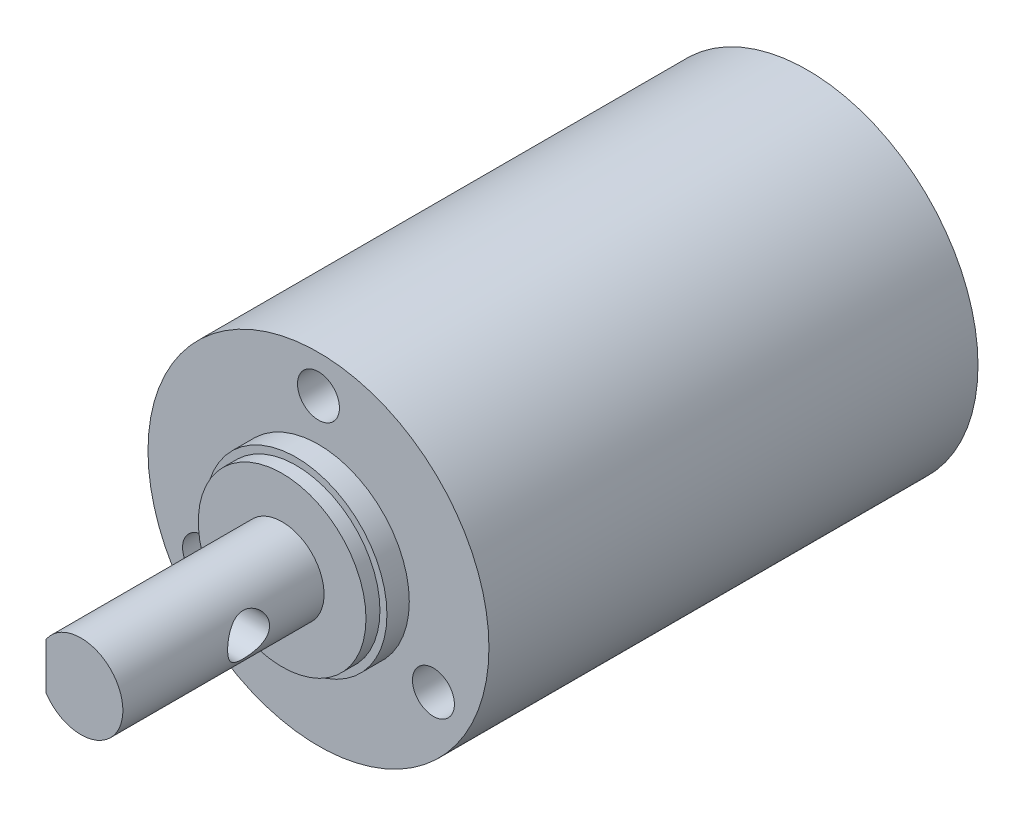
ISO-10303-21;
HEADER;
FILE_DESCRIPTION(('STEP AP214'),'2;1');
FILE_NAME('part.step','',(''),(''),'','','');
FILE_SCHEMA(('AUTOMOTIVE_DESIGN { 1 0 10303 214 1 1 1 1 }'));
ENDSEC;
DATA;
#1=APPLICATION_CONTEXT('core data for automotive mechanical design processes');
#2=APPLICATION_PROTOCOL_DEFINITION('international standard','automotive_design',2000,#1);
#3=PRODUCT_CONTEXT('',#1,'mechanical');
#4=PRODUCT('Part','Part','',(#3));
#5=PRODUCT_RELATED_PRODUCT_CATEGORY('part','',(#4));
#6=PRODUCT_DEFINITION_FORMATION('','',#4);
#7=PRODUCT_DEFINITION_CONTEXT('part definition',#1,'design');
#8=PRODUCT_DEFINITION('design','',#6,#7);
#9=PRODUCT_DEFINITION_SHAPE('','',#8);
#10=(LENGTH_UNIT() NAMED_UNIT(*) SI_UNIT(.MILLI.,.METRE.));
#11=(NAMED_UNIT(*) PLANE_ANGLE_UNIT() SI_UNIT($,.RADIAN.));
#12=(NAMED_UNIT(*) SI_UNIT($,.STERADIAN.) SOLID_ANGLE_UNIT());
#13=UNCERTAINTY_MEASURE_WITH_UNIT(LENGTH_MEASURE(1.E-05),#10,'distance_accuracy_value','');
#14=(GEOMETRIC_REPRESENTATION_CONTEXT(3) GLOBAL_UNCERTAINTY_ASSIGNED_CONTEXT((#13)) GLOBAL_UNIT_ASSIGNED_CONTEXT((#10,
#11,#12)) REPRESENTATION_CONTEXT('',''));
#15=CARTESIAN_POINT('',(0.,0.,0.));
#16=DIRECTION('',(0.,0.,1.));
#17=DIRECTION('',(1.,0.,0.));
#18=AXIS2_PLACEMENT_3D('',#15,#16,#17);
#19=CARTESIAN_POINT('',(0.,0.,37.6));
#20=DIRECTION('',(0.,0.,-1.));
#21=DIRECTION('',(-1.,0.,0.));
#22=AXIS2_PLACEMENT_3D('',#19,#20,#21);
#23=CYLINDRICAL_SURFACE('',#22,6.5);
#24=CARTESIAN_POINT('',(0.,0.,35.));
#25=DIRECTION('',(0.,0.,1.));
#26=DIRECTION('',(1.,0.,0.));
#27=AXIS2_PLACEMENT_3D('',#24,#25,#26);
#28=CIRCLE('',#27,6.5);
#29=CARTESIAN_POINT('',(6.5,0.,35.));
#30=VERTEX_POINT('',#29);
#31=EDGE_CURVE('E86',#30,#30,#28,.T.);
#32=ORIENTED_EDGE('',*,*,#31,.T.);
#33=EDGE_LOOP('',(#32));
#34=FACE_BOUND('',#33,.T.);
#35=CARTESIAN_POINT('',(0.,0.,36.6));
#36=DIRECTION('',(0.,0.,1.));
#37=DIRECTION('',(1.,0.,0.));
#38=AXIS2_PLACEMENT_3D('',#35,#36,#37);
#39=CIRCLE('',#38,6.5);
#40=CARTESIAN_POINT('',(6.5,0.,36.6));
#41=VERTEX_POINT('',#40);
#42=EDGE_CURVE('E77',#41,#41,#39,.T.);
#43=ORIENTED_EDGE('',*,*,#42,.F.);
#44=EDGE_LOOP('',(#43));
#45=FACE_BOUND('',#44,.T.);
#46=ADVANCED_FACE('F35',(#34,#45),#23,.T.);
#47=CARTESIAN_POINT('',(0.,0.,35.));
#48=DIRECTION('',(0.,0.,1.));
#49=DIRECTION('',(1.,0.,0.));
#50=AXIS2_PLACEMENT_3D('',#47,#48,#49);
#51=PLANE('',#50);
#52=CARTESIAN_POINT('',(-8.22724133595156,-4.75000000000035,35.));
#53=DIRECTION('',(0.,0.,1.));
#54=DIRECTION('',(1.,0.,0.));
#55=AXIS2_PLACEMENT_3D('',#52,#53,#54);
#56=CIRCLE('',#55,1.50000000000077);
#57=CARTESIAN_POINT('',(-6.72724133595079,-4.75000000000035,35.));
#58=VERTEX_POINT('',#57);
#59=EDGE_CURVE('E278',#58,#58,#56,.T.);
#60=ORIENTED_EDGE('',*,*,#59,.F.);
#61=EDGE_LOOP('',(#60));
#62=FACE_BOUND('',#61,.T.);
#63=CARTESIAN_POINT('',(8.22724133595277,-4.74999999999965,35.));
#64=DIRECTION('',(0.,0.,1.));
#65=DIRECTION('',(1.,0.,0.));
#66=AXIS2_PLACEMENT_3D('',#63,#64,#65);
#67=CIRCLE('',#66,1.50000000000052);
#68=CARTESIAN_POINT('',(9.7272413359533,-4.74999999999965,35.));
#69=VERTEX_POINT('',#68);
#70=EDGE_CURVE('E277',#69,#69,#67,.T.);
#71=ORIENTED_EDGE('',*,*,#70,.F.);
#72=EDGE_LOOP('',(#71));
#73=FACE_BOUND('',#72,.T.);
#74=CARTESIAN_POINT('',(0.,9.5,35.));
#75=DIRECTION('',(0.,0.,1.));
#76=DIRECTION('',(1.,0.,0.));
#77=AXIS2_PLACEMENT_3D('',#74,#75,#76);
#78=CIRCLE('',#77,1.5);
#79=CARTESIAN_POINT('',(1.5,9.5,35.));
#80=VERTEX_POINT('',#79);
#81=EDGE_CURVE('E287',#80,#80,#78,.T.);
#82=ORIENTED_EDGE('',*,*,#81,.F.);
#83=EDGE_LOOP('',(#82));
#84=FACE_BOUND('',#83,.T.);
#85=CARTESIAN_POINT('',(0.,0.,35.));
#86=DIRECTION('',(0.,0.,1.));
#87=DIRECTION('',(1.,0.,0.));
#88=AXIS2_PLACEMENT_3D('',#85,#86,#87);
#89=CIRCLE('',#88,12.2);
#90=CARTESIAN_POINT('',(12.2,0.,35.));
#91=VERTEX_POINT('',#90);
#92=EDGE_CURVE('E11',#91,#91,#89,.T.);
#93=ORIENTED_EDGE('',*,*,#92,.T.);
#94=EDGE_LOOP('',(#93));
#95=FACE_BOUND('',#94,.T.);
#96=ORIENTED_EDGE('',*,*,#31,.F.);
#97=EDGE_LOOP('',(#96));
#98=FACE_BOUND('',#97,.T.);
#99=ADVANCED_FACE('F104',(#62,#73,#84,#95,#98),#51,.T.);
#100=CARTESIAN_POINT('',(0.,0.,35.));
#101=DIRECTION('',(0.,0.,-1.));
#102=DIRECTION('',(-1.,0.,0.));
#103=AXIS2_PLACEMENT_3D('',#100,#101,#102);
#104=CYLINDRICAL_SURFACE('',#103,12.2);
#105=ORIENTED_EDGE('',*,*,#92,.F.);
#106=EDGE_LOOP('',(#105));
#107=FACE_BOUND('',#106,.T.);
#108=CARTESIAN_POINT('',(0.,0.,0.));
#109=DIRECTION('',(0.,0.,1.));
#110=DIRECTION('',(1.,0.,0.));
#111=AXIS2_PLACEMENT_3D('',#108,#109,#110);
#112=CIRCLE('',#111,12.2);
#113=CARTESIAN_POINT('',(12.2,0.,0.));
#114=VERTEX_POINT('',#113);
#115=EDGE_CURVE('E39',#114,#114,#112,.T.);
#116=ORIENTED_EDGE('',*,*,#115,.T.);
#117=EDGE_LOOP('',(#116));
#118=FACE_BOUND('',#117,.T.);
#119=ADVANCED_FACE('F37',(#107,#118),#104,.T.);
#120=CARTESIAN_POINT('',(0.,0.,0.));
#121=DIRECTION('',(0.,0.,1.));
#122=DIRECTION('',(1.,0.,0.));
#123=AXIS2_PLACEMENT_3D('',#120,#121,#122);
#124=PLANE('',#123);
#125=ORIENTED_EDGE('',*,*,#115,.F.);
#126=EDGE_LOOP('',(#125));
#127=FACE_BOUND('',#126,.T.);
#128=ADVANCED_FACE('F94',(#127),#124,.F.);
#129=CARTESIAN_POINT('',(0.,0.,36.6));
#130=DIRECTION('',(0.,0.,1.));
#131=DIRECTION('',(1.,0.,0.));
#132=AXIS2_PLACEMENT_3D('',#129,#130,#131);
#133=PLANE('',#132);
#134=CARTESIAN_POINT('',(0.,0.,36.6));
#135=DIRECTION('',(0.,0.,1.));
#136=DIRECTION('',(1.,0.,0.));
#137=AXIS2_PLACEMENT_3D('',#134,#135,#136);
#138=CIRCLE('',#137,6.);
#139=CARTESIAN_POINT('',(6.,0.,36.6));
#140=VERTEX_POINT('',#139);
#141=EDGE_CURVE('E80',#140,#140,#138,.T.);
#142=ORIENTED_EDGE('',*,*,#141,.F.);
#143=EDGE_LOOP('',(#142));
#144=FACE_BOUND('',#143,.T.);
#145=ORIENTED_EDGE('',*,*,#42,.T.);
#146=EDGE_LOOP('',(#145));
#147=FACE_BOUND('',#146,.T.);
#148=ADVANCED_FACE('F96',(#144,#147),#133,.T.);
#149=CARTESIAN_POINT('',(0.,0.,36.6));
#150=DIRECTION('',(0.,0.,1.));
#151=DIRECTION('',(1.,0.,0.));
#152=AXIS2_PLACEMENT_3D('',#149,#150,#151);
#153=CYLINDRICAL_SURFACE('',#152,6.);
#154=ORIENTED_EDGE('',*,*,#141,.T.);
#155=EDGE_LOOP('',(#154));
#156=FACE_BOUND('',#155,.T.);
#157=CARTESIAN_POINT('',(0.,0.,37.6));
#158=DIRECTION('',(0.,0.,1.));
#159=DIRECTION('',(1.,0.,0.));
#160=AXIS2_PLACEMENT_3D('',#157,#158,#159);
#161=CIRCLE('',#160,6.);
#162=CARTESIAN_POINT('',(6.,0.,37.6));
#163=VERTEX_POINT('',#162);
#164=EDGE_CURVE('E132',#163,#163,#161,.T.);
#165=ORIENTED_EDGE('',*,*,#164,.F.);
#166=EDGE_LOOP('',(#165));
#167=FACE_BOUND('',#166,.T.);
#168=ADVANCED_FACE('F101',(#156,#167),#153,.T.);
#169=CARTESIAN_POINT('',(0.,0.,52.));
#170=DIRECTION('',(0.,0.,1.));
#171=DIRECTION('',(1.,0.,0.));
#172=AXIS2_PLACEMENT_3D('',#169,#170,#171);
#173=PLANE('',#172);
#174=CARTESIAN_POINT('',(0.,0.,52.));
#175=DIRECTION('',(0.,0.,1.));
#176=DIRECTION('',(1.,0.,0.));
#177=AXIS2_PLACEMENT_3D('',#174,#175,#176);
#178=CIRCLE('',#177,3.);
#179=CARTESIAN_POINT('',(-2.5,-1.6583123951777,52.));
#180=VERTEX_POINT('',#179);
#181=CARTESIAN_POINT('',(-2.5,1.6583123951777,52.));
#182=VERTEX_POINT('',#181);
#183=EDGE_CURVE('E71',#180,#182,#178,.T.);
#184=ORIENTED_EDGE('',*,*,#183,.T.);
#185=DIRECTION('',(0.,-1.,0.));
#186=VECTOR('',#185,1.);
#187=CARTESIAN_POINT('',(-2.5,1.6583123951777,52.));
#188=LINE('',#187,#186);
#189=EDGE_CURVE('E58',#182,#180,#188,.T.);
#190=ORIENTED_EDGE('',*,*,#189,.T.);
#191=EDGE_LOOP('',(#184,#190));
#192=FACE_BOUND('',#191,.T.);
#193=ADVANCED_FACE('F121',(#192),#173,.T.);
#194=CARTESIAN_POINT('',(0.,0.,52.));
#195=DIRECTION('',(0.,0.,-1.));
#196=DIRECTION('',(-1.,0.,0.));
#197=AXIS2_PLACEMENT_3D('',#194,#195,#196);
#198=CYLINDRICAL_SURFACE('',#197,3.);
#199=CARTESIAN_POINT('',(3.,0.,44.5));
#200=CARTESIAN_POINT('',(2.99999570107562,0.0788579444268501,44.4999950465242));
#201=CARTESIAN_POINT('',(2.99685736529635,0.157809899546343,44.4937448903184));
#202=CARTESIAN_POINT('',(2.98461234055736,0.313380352903344,44.4690206794877));
#203=CARTESIAN_POINT('',(2.97549431743379,0.389994130070445,44.4505234105033));
#204=CARTESIAN_POINT('',(2.95224419105063,0.538400317320674,44.4022092870751));
#205=CARTESIAN_POINT('',(2.93813158766306,0.610210204408719,44.3724364236281));
#206=CARTESIAN_POINT('',(2.90618664773642,0.747708925209898,44.3026440679525));
#207=CARTESIAN_POINT('',(2.88835460450288,0.81339824098509,44.2626253836267));
#208=CARTESIAN_POINT('',(2.84934387387093,0.941261726642865,44.1707241257721));
#209=CARTESIAN_POINT('',(2.82802798691306,1.00298281668316,44.1182702811405));
#210=CARTESIAN_POINT('',(2.78489955370115,1.11716916730047,44.0042177811295));
#211=CARTESIAN_POINT('',(2.76308664313552,1.16962737466015,43.9426122223413));
#212=CARTESIAN_POINT('',(2.71948426796021,1.26787800067542,43.8062749757149));
#213=CARTESIAN_POINT('',(2.69782780455198,1.31283800332746,43.7308958524811));
#214=CARTESIAN_POINT('',(2.65928968158481,1.38925234033605,43.5724489960207));
#215=CARTESIAN_POINT('',(2.64240461410484,1.4207163224495,43.4893868069159));
#216=CARTESIAN_POINT('',(2.61686800556713,1.46719866328289,43.3230023418671));
#217=CARTESIAN_POINT('',(2.6077840737557,1.48308878562067,43.2399933218989));
#218=CARTESIAN_POINT('',(2.59772834922791,1.50064048996327,43.0720317433308));
#219=CARTESIAN_POINT('',(2.59674854014932,1.50231613255961,42.9870811886933));
#220=CARTESIAN_POINT('',(2.60266395385873,1.49203093075845,42.828570963527));
#221=CARTESIAN_POINT('',(2.6086314549302,1.48167683930524,42.7548639531654));
#222=CARTESIAN_POINT('',(2.62614343100775,1.4504097735854,42.6104171359404));
#223=CARTESIAN_POINT('',(2.63768968247664,1.42949343584648,42.539678282042));
#224=CARTESIAN_POINT('',(2.66531214619111,1.37731467057901,42.4011563011515));
#225=CARTESIAN_POINT('',(2.68148760995998,1.34582260067399,42.3334804018213));
#226=CARTESIAN_POINT('',(2.71655106422105,1.273562531502,42.204048561115));
#227=CARTESIAN_POINT('',(2.73544027170286,1.2327903657187,42.1422952965999));
#228=CARTESIAN_POINT('',(2.77669736854929,1.13709908236919,42.0182181208852));
#229=CARTESIAN_POINT('',(2.79920265355119,1.08104168755392,41.9568146896358));
#230=CARTESIAN_POINT('',(2.84321434950611,0.959333368112058,41.8438968721137));
#231=CARTESIAN_POINT('',(2.86472027938201,0.893677884861427,41.7923872119492));
#232=CARTESIAN_POINT('',(2.90552980924446,0.750774758747772,41.6984715084554));
#233=CARTESIAN_POINT('',(2.92468476243011,0.673130387399112,41.6565992913314));
#234=CARTESIAN_POINT('',(2.95736821681863,0.510699323233194,41.5868544564355));
#235=CARTESIAN_POINT('',(2.9709011841533,0.425918364397914,41.5589707224773));
#236=CARTESIAN_POINT('',(2.98986500612153,0.259149737491055,41.520286894425));
#237=CARTESIAN_POINT('',(2.99587407451965,0.177512295822491,41.5082631463798));
#238=CARTESIAN_POINT('',(3.00109520188655,0.0131693999240301,41.4978029032983));
#239=CARTESIAN_POINT('',(3.00031048081978,-0.0695355298048597,41.4993599715408));
#240=CARTESIAN_POINT('',(2.99236788380152,-0.226849457978976,41.5153100326281));
#241=CARTESIAN_POINT('',(2.98570868532253,-0.301589112074892,41.528698799095));
#242=CARTESIAN_POINT('',(2.9673325697226,-0.447610338452909,41.5663571078427));
#243=CARTESIAN_POINT('',(2.95561509501618,-0.518891528536628,41.5906278496802));
#244=CARTESIAN_POINT('',(2.92776377120382,-0.658332912674357,41.6499976996495));
#245=CARTESIAN_POINT('',(2.91151322654446,-0.726345595508701,41.6853865751744));
#246=CARTESIAN_POINT('',(2.87615961476127,-0.855692042548905,41.7656613034698));
#247=CARTESIAN_POINT('',(2.85705533350407,-0.917022944664887,41.8105512018931));
#248=CARTESIAN_POINT('',(2.81562332004297,-1.03765153393382,41.9136406379961));
#249=CARTESIAN_POINT('',(2.79316327265249,-1.09615811672854,41.9727143026677));
#250=CARTESIAN_POINT('',(2.7489358741323,-1.20278448167828,42.0998877269166));
#251=CARTESIAN_POINT('',(2.72716901100071,-1.25089707856781,42.1679936782719));
#252=CARTESIAN_POINT('',(2.68576788309734,-1.33756187171853,42.3154654812595));
#253=CARTESIAN_POINT('',(2.66628794383591,-1.37553824370037,42.3952168991417));
#254=CARTESIAN_POINT('',(2.63361108441202,-1.43712423890206,42.5612651013624));
#255=CARTESIAN_POINT('',(2.62040607332625,-1.46075237380053,42.6475532897003));
#256=CARTESIAN_POINT('',(2.60342251538703,-1.49079253120031,42.8153653343271));
#257=CARTESIAN_POINT('',(2.59886075197597,-1.49863949460818,42.8965513801529));
#258=CARTESIAN_POINT('',(2.59748031962405,-1.50103373156431,43.0591706007468));
#259=CARTESIAN_POINT('',(2.60065829439585,-1.49558676993487,43.1406036531068));
#260=CARTESIAN_POINT('',(2.61356793076615,-1.47288918838997,43.2932252523002));
#261=CARTESIAN_POINT('',(2.62264641723987,-1.45681247151455,43.3646507052171));
#262=CARTESIAN_POINT('',(2.64556524281479,-1.41476303733662,43.5037121791365));
#263=CARTESIAN_POINT('',(2.65940711354502,-1.38878713673989,43.571346973138));
#264=CARTESIAN_POINT('',(2.69142795546803,-1.32572361795085,43.7059372764798));
#265=CARTESIAN_POINT('',(2.70983583593881,-1.28800670672356,43.7725418527435));
#266=CARTESIAN_POINT('',(2.7485299745229,-1.20322645745609,43.8989118042719));
#267=CARTESIAN_POINT('',(2.76881720693416,-1.15615825686235,43.9586735957817));
#268=CARTESIAN_POINT('',(2.81193484737138,-1.04730498999207,44.077212973532));
#269=CARTESIAN_POINT('',(2.83477474959942,-0.984426634495897,44.1349886535254));
#270=CARTESIAN_POINT('',(2.87816628389896,-0.849232209349801,44.2393944751529));
#271=CARTESIAN_POINT('',(2.89871667939292,-0.776911084957803,44.2860186092049));
#272=CARTESIAN_POINT('',(2.93547014349806,-0.623897395174429,44.3668545440681));
#273=CARTESIAN_POINT('',(2.95164144740899,-0.543149255665106,44.4009762538547));
#274=CARTESIAN_POINT('',(2.9775201194848,-0.376113151707139,44.4547122516361));
#275=CARTESIAN_POINT('',(2.98724585044602,-0.289841699383657,44.4743677702086));
#276=CARTESIAN_POINT('',(2.99543192870217,-0.168902919736349,44.4908461166286));
#277=CARTESIAN_POINT('',(2.99714048010376,-0.135242819162353,44.4942739612995));
#278=CARTESIAN_POINT('',(2.99942545465223,-0.0677275977076409,44.4988519982711));
#279=CARTESIAN_POINT('',(3.00000184655071,-0.0338724714699444,44.5000021277053));
#280=CARTESIAN_POINT('',(3.,0.,44.5));
#281=B_SPLINE_CURVE_WITH_KNOTS('',3,(#199,#200,#201,#202,#203,#204,#205,#206,#207,#208,#209,
#210,#211,#212,#213,#214,#215,#216,#217,#218,#219,#220,#221,#222,#223,#224,#225,#226,#227,#228,
#229,#230,#231,#232,#233,#234,#235,#236,#237,#238,#239,#240,#241,#242,#243,#244,#245,#246,#247,
#248,#249,#250,#251,#252,#253,#254,#255,#256,#257,#258,#259,#260,#261,#262,#263,#264,#265,#266,
#267,#268,#269,#270,#271,#272,#273,#274,#275,#276,#277,#278,#279,#280),.UNSPECIFIED.,.T.,.F.,(4,
2,2,2,2,2,2,2,2,2,2,2,2,2,2,2,2,2,2,2,2,2,2,2,2,2,2,2,2,2,2,2,2,2,2,2,2,2,2,2,4),(0.,
0.236436386130438,0.473322224563797,0.709293233238445,0.945245640872351,1.19547263807713,
1.44588935648105,1.71572589646129,1.98536921847422,2.23887018210345,2.49212035993531,
2.71508568613981,2.93812205888519,3.16635360252732,3.39468781890334,3.65197412000819,
3.90938301898031,4.17874533321662,4.44789325368421,4.6947493570702,4.94148846767215,
5.16910359759184,5.39674382446399,5.63089284041849,5.8651417612251,6.12239415966629,
6.3798238292315,6.6497202324259,6.91926767918178,7.16293961254571,7.40650589797019,
7.62686895373285,7.84730293182529,8.08254685170433,8.31791341715448,8.58187864135759,
8.8459857507187,9.11196020495292,9.37717362931726,9.47872920200877,9.58028757766602),.UNSPECIFIED.);
#282=CARTESIAN_POINT('',(3.,0.,44.5));
#283=VERTEX_POINT('',#282);
#284=EDGE_CURVE('E125',#283,#283,#281,.T.);
#285=ORIENTED_EDGE('',*,*,#284,.T.);
#286=EDGE_LOOP('',(#285));
#287=FACE_BOUND('',#286,.T.);
#288=CARTESIAN_POINT('',(0.,0.,37.6));
#289=DIRECTION('',(0.,0.,1.));
#290=DIRECTION('',(1.,0.,0.));
#291=AXIS2_PLACEMENT_3D('',#288,#289,#290);
#292=CIRCLE('',#291,3.);
#293=CARTESIAN_POINT('',(-2.5,-1.6583123951777,37.6));
#294=VERTEX_POINT('',#293);
#295=CARTESIAN_POINT('',(-2.5,1.6583123951777,37.6));
#296=VERTEX_POINT('',#295);
#297=EDGE_CURVE('E50',#294,#296,#292,.T.);
#298=ORIENTED_EDGE('',*,*,#297,.T.);
#299=DIRECTION('',(0.,0.,-1.));
#300=VECTOR('',#299,1.);
#301=CARTESIAN_POINT('',(-2.5,1.6583123951777,52.));
#302=LINE('',#301,#300);
#303=EDGE_CURVE('E69',#182,#296,#302,.T.);
#304=ORIENTED_EDGE('',*,*,#303,.F.);
#305=ORIENTED_EDGE('',*,*,#183,.F.);
#306=DIRECTION('',(0.,0.,-1.));
#307=VECTOR('',#306,1.);
#308=CARTESIAN_POINT('',(-2.5,-1.6583123951777,52.));
#309=LINE('',#308,#307);
#310=EDGE_CURVE('E67',#180,#294,#309,.T.);
#311=ORIENTED_EDGE('',*,*,#310,.T.);
#312=EDGE_LOOP('',(#298,#304,#305,#311));
#313=FACE_BOUND('',#312,.T.);
#314=ADVANCED_FACE('F73',(#287,#313),#198,.T.);
#315=CARTESIAN_POINT('',(-2.5,1.6583123951777,52.));
#316=DIRECTION('',(1.,0.,0.));
#317=DIRECTION('',(0.,0.,-1.));
#318=AXIS2_PLACEMENT_3D('',#315,#316,#317);
#319=PLANE('',#318);
#320=CARTESIAN_POINT('',(-2.5,0.,43.));
#321=DIRECTION('',(-1.,0.,0.));
#322=DIRECTION('',(0.,0.,1.));
#323=AXIS2_PLACEMENT_3D('',#320,#321,#322);
#324=CIRCLE('',#323,1.5);
#325=CARTESIAN_POINT('',(-2.5,0.,44.5));
#326=VERTEX_POINT('',#325);
#327=EDGE_CURVE('E133',#326,#326,#324,.T.);
#328=ORIENTED_EDGE('',*,*,#327,.F.);
#329=EDGE_LOOP('',(#328));
#330=FACE_BOUND('',#329,.T.);
#331=DIRECTION('',(0.,-1.,0.));
#332=VECTOR('',#331,1.);
#333=CARTESIAN_POINT('',(-2.5,1.6583123951777,37.6));
#334=LINE('',#333,#332);
#335=EDGE_CURVE('E65',#296,#294,#334,.T.);
#336=ORIENTED_EDGE('',*,*,#335,.T.);
#337=ORIENTED_EDGE('',*,*,#310,.F.);
#338=ORIENTED_EDGE('',*,*,#189,.F.);
#339=ORIENTED_EDGE('',*,*,#303,.T.);
#340=EDGE_LOOP('',(#336,#337,#338,#339));
#341=FACE_BOUND('',#340,.T.);
#342=ADVANCED_FACE('F66',(#330,#341),#319,.F.);
#343=CARTESIAN_POINT('',(0.,0.,37.6));
#344=DIRECTION('',(0.,0.,1.));
#345=DIRECTION('',(1.,0.,0.));
#346=AXIS2_PLACEMENT_3D('',#343,#344,#345);
#347=PLANE('',#346);
#348=ORIENTED_EDGE('',*,*,#335,.F.);
#349=ORIENTED_EDGE('',*,*,#297,.F.);
#350=EDGE_LOOP('',(#348,#349));
#351=FACE_BOUND('',#350,.T.);
#352=ORIENTED_EDGE('',*,*,#164,.T.);
#353=EDGE_LOOP('',(#352));
#354=FACE_BOUND('',#353,.T.);
#355=ADVANCED_FACE('F75',(#351,#354),#347,.T.);
#356=CARTESIAN_POINT('',(12.2,0.,43.));
#357=DIRECTION('',(-1.,0.,0.));
#358=DIRECTION('',(0.,0.,1.));
#359=AXIS2_PLACEMENT_3D('',#356,#357,#358);
#360=CYLINDRICAL_SURFACE('',#359,1.5);
#361=ORIENTED_EDGE('',*,*,#327,.T.);
#362=EDGE_LOOP('',(#361));
#363=FACE_BOUND('',#362,.T.);
#364=ORIENTED_EDGE('',*,*,#284,.F.);
#365=EDGE_LOOP('',(#364));
#366=FACE_BOUND('',#365,.T.);
#367=ADVANCED_FACE('F117',(#363,#366),#360,.F.);
#368=CARTESIAN_POINT('',(0.,9.5,31.));
#369=DIRECTION('',(0.,0.,1.));
#370=DIRECTION('',(1.,0.,0.));
#371=AXIS2_PLACEMENT_3D('',#368,#369,#370);
#372=CYLINDRICAL_SURFACE('',#371,1.5);
#373=CARTESIAN_POINT('',(0.,9.5,31.));
#374=DIRECTION('',(0.,0.,1.));
#375=DIRECTION('',(1.,0.,0.));
#376=AXIS2_PLACEMENT_3D('',#373,#374,#375);
#377=CIRCLE('',#376,1.5);
#378=CARTESIAN_POINT('',(1.5,9.5,31.));
#379=VERTEX_POINT('',#378);
#380=EDGE_CURVE('E289',#379,#379,#377,.T.);
#381=ORIENTED_EDGE('',*,*,#380,.F.);
#382=EDGE_LOOP('',(#381));
#383=FACE_BOUND('',#382,.T.);
#384=ORIENTED_EDGE('',*,*,#81,.T.);
#385=EDGE_LOOP('',(#384));
#386=FACE_BOUND('',#385,.T.);
#387=ADVANCED_FACE('F140',(#383,#386),#372,.F.);
#388=CARTESIAN_POINT('',(0.,9.5,31.));
#389=DIRECTION('',(0.,0.,1.));
#390=DIRECTION('',(1.,0.,0.));
#391=AXIS2_PLACEMENT_3D('',#388,#389,#390);
#392=PLANE('',#391);
#393=ORIENTED_EDGE('',*,*,#380,.T.);
#394=EDGE_LOOP('',(#393));
#395=FACE_BOUND('',#394,.T.);
#396=ADVANCED_FACE('F182',(#395),#392,.T.);
#397=CARTESIAN_POINT('',(8.22724133595277,-4.74999999999965,31.));
#398=DIRECTION('',(0.,0.,1.));
#399=DIRECTION('',(1.,0.,0.));
#400=AXIS2_PLACEMENT_3D('',#397,#398,#399);
#401=CYLINDRICAL_SURFACE('',#400,1.50000000000052);
#402=CARTESIAN_POINT('',(8.22724133595277,-4.74999999999965,31.));
#403=DIRECTION('',(0.,0.,1.));
#404=DIRECTION('',(1.,0.,0.));
#405=AXIS2_PLACEMENT_3D('',#402,#403,#404);
#406=CIRCLE('',#405,1.50000000000052);
#407=CARTESIAN_POINT('',(9.7272413359533,-4.74999999999965,31.));
#408=VERTEX_POINT('',#407);
#409=EDGE_CURVE('E281',#408,#408,#406,.T.);
#410=ORIENTED_EDGE('',*,*,#409,.F.);
#411=EDGE_LOOP('',(#410));
#412=FACE_BOUND('',#411,.T.);
#413=ORIENTED_EDGE('',*,*,#70,.T.);
#414=EDGE_LOOP('',(#413));
#415=FACE_BOUND('',#414,.T.);
#416=ADVANCED_FACE('F189',(#412,#415),#401,.F.);
#417=CARTESIAN_POINT('',(8.22724133595277,-4.74999999999965,31.));
#418=DIRECTION('',(0.,0.,1.));
#419=DIRECTION('',(1.,0.,0.));
#420=AXIS2_PLACEMENT_3D('',#417,#418,#419);
#421=PLANE('',#420);
#422=ORIENTED_EDGE('',*,*,#409,.T.);
#423=EDGE_LOOP('',(#422));
#424=FACE_BOUND('',#423,.T.);
#425=ADVANCED_FACE('F196',(#424),#421,.T.);
#426=CARTESIAN_POINT('',(-8.22724133595156,-4.75000000000035,31.));
#427=DIRECTION('',(0.,0.,1.));
#428=DIRECTION('',(1.,0.,0.));
#429=AXIS2_PLACEMENT_3D('',#426,#427,#428);
#430=CYLINDRICAL_SURFACE('',#429,1.50000000000077);
#431=CARTESIAN_POINT('',(-8.22724133595156,-4.75000000000035,31.));
#432=DIRECTION('',(0.,0.,1.));
#433=DIRECTION('',(1.,0.,0.));
#434=AXIS2_PLACEMENT_3D('',#431,#432,#433);
#435=CIRCLE('',#434,1.50000000000077);
#436=CARTESIAN_POINT('',(-6.72724133595079,-4.75000000000035,31.));
#437=VERTEX_POINT('',#436);
#438=EDGE_CURVE('E276',#437,#437,#435,.T.);
#439=ORIENTED_EDGE('',*,*,#438,.F.);
#440=EDGE_LOOP('',(#439));
#441=FACE_BOUND('',#440,.T.);
#442=ORIENTED_EDGE('',*,*,#59,.T.);
#443=EDGE_LOOP('',(#442));
#444=FACE_BOUND('',#443,.T.);
#445=ADVANCED_FACE('F204',(#441,#444),#430,.F.);
#446=CARTESIAN_POINT('',(-8.22724133595156,-4.75000000000035,31.));
#447=DIRECTION('',(0.,0.,1.));
#448=DIRECTION('',(1.,0.,0.));
#449=AXIS2_PLACEMENT_3D('',#446,#447,#448);
#450=PLANE('',#449);
#451=ORIENTED_EDGE('',*,*,#438,.T.);
#452=EDGE_LOOP('',(#451));
#453=FACE_BOUND('',#452,.T.);
#454=ADVANCED_FACE('F212',(#453),#450,.T.);
#455=CLOSED_SHELL('',(#46,#99,#119,#128,#148,#168,#193,#314,#342,#355,#367,#387,#396,#416,#425,
#445,#454));
#456=MANIFOLD_SOLID_BREP('B2',#455);
#457=ADVANCED_BREP_SHAPE_REPRESENTATION('',(#18,#456),#14);
#458=SHAPE_DEFINITION_REPRESENTATION(#9,#457);
ENDSEC;
END-ISO-10303-21;
